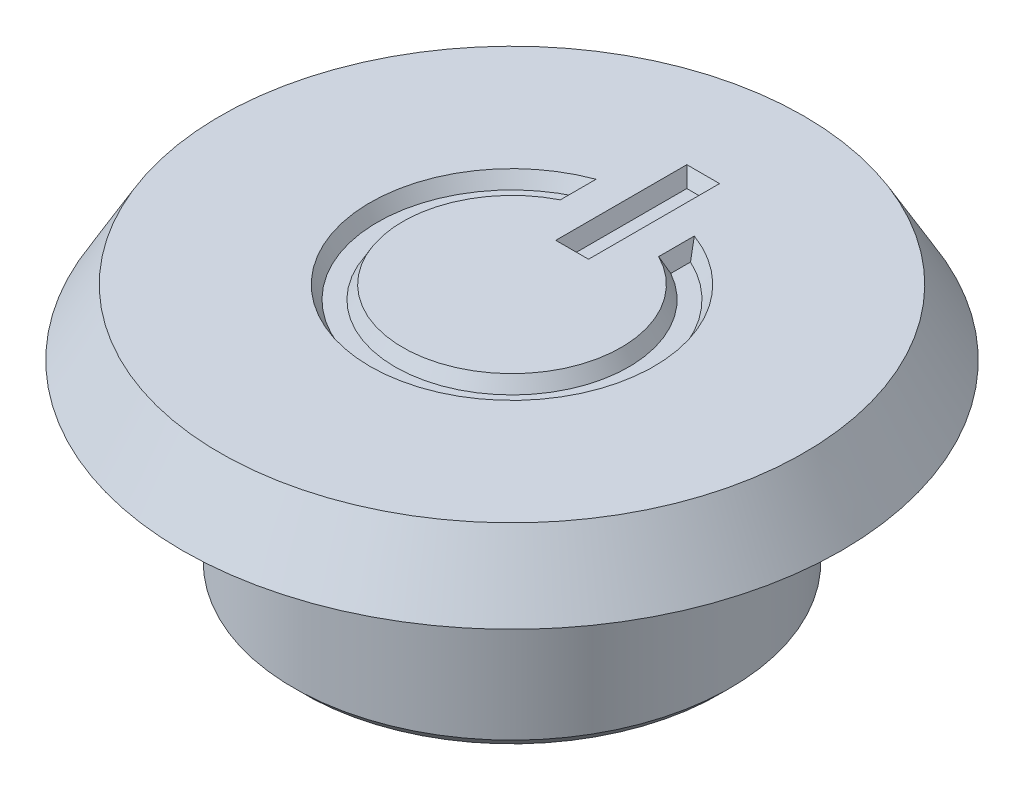
ISO-10303-21;
HEADER;
FILE_DESCRIPTION(('STEP AP214'),'2;1');
FILE_NAME('part.step','',(''),(''),'','','');
FILE_SCHEMA(('AUTOMOTIVE_DESIGN { 1 0 10303 214 1 1 1 1 }'));
ENDSEC;
DATA;
#1=APPLICATION_CONTEXT('core data for automotive mechanical design processes');
#2=APPLICATION_PROTOCOL_DEFINITION('international standard','automotive_design',2000,#1);
#3=PRODUCT_CONTEXT('',#1,'mechanical');
#4=PRODUCT('Part','Part','',(#3));
#5=PRODUCT_RELATED_PRODUCT_CATEGORY('part','',(#4));
#6=PRODUCT_DEFINITION_FORMATION('','',#4);
#7=PRODUCT_DEFINITION_CONTEXT('part definition',#1,'design');
#8=PRODUCT_DEFINITION('design','',#6,#7);
#9=PRODUCT_DEFINITION_SHAPE('','',#8);
#10=(LENGTH_UNIT() NAMED_UNIT(*) SI_UNIT(.MILLI.,.METRE.));
#11=(NAMED_UNIT(*) PLANE_ANGLE_UNIT() SI_UNIT($,.RADIAN.));
#12=(NAMED_UNIT(*) SI_UNIT($,.STERADIAN.) SOLID_ANGLE_UNIT());
#13=UNCERTAINTY_MEASURE_WITH_UNIT(LENGTH_MEASURE(1.E-05),#10,'distance_accuracy_value','');
#14=(GEOMETRIC_REPRESENTATION_CONTEXT(3) GLOBAL_UNCERTAINTY_ASSIGNED_CONTEXT((#13)) GLOBAL_UNIT_ASSIGNED_CONTEXT((#10,
#11,#12)) REPRESENTATION_CONTEXT('',''));
#15=CARTESIAN_POINT('',(0.,0.,0.));
#16=DIRECTION('',(0.,0.,1.));
#17=DIRECTION('',(1.,0.,0.));
#18=AXIS2_PLACEMENT_3D('',#15,#16,#17);
#19=CARTESIAN_POINT('',(-15.,61.1009950989381,0.));
#20=DIRECTION('',(0.,1.,0.));
#21=DIRECTION('',(0.,0.,1.));
#22=AXIS2_PLACEMENT_3D('',#19,#20,#21);
#23=PLANE('',#22);
#24=CARTESIAN_POINT('',(0.,61.1009950989381,0.));
#25=DIRECTION('',(0.,-1.,0.));
#26=DIRECTION('',(0.,0.,-1.));
#27=AXIS2_PLACEMENT_3D('',#24,#25,#26);
#28=CIRCLE('',#27,15.);
#29=CARTESIAN_POINT('',(0.,61.1009950989381,-15.));
#30=VERTEX_POINT('',#29);
#31=EDGE_CURVE('E11',#30,#30,#28,.T.);
#32=ORIENTED_EDGE('',*,*,#31,.T.);
#33=EDGE_LOOP('',(#32));
#34=FACE_BOUND('',#33,.T.);
#35=ADVANCED_FACE('F35',(#34),#23,.F.);
#36=CARTESIAN_POINT('',(0.,58.1009950989381,0.));
#37=DIRECTION('',(0.,-1.,0.));
#38=DIRECTION('',(0.,0.,-1.));
#39=AXIS2_PLACEMENT_3D('',#36,#37,#38);
#40=TOROIDAL_SURFACE('',#39,15.,3.);
#41=ORIENTED_EDGE('',*,*,#31,.F.);
#42=EDGE_LOOP('',(#41));
#43=FACE_BOUND('',#42,.T.);
#44=CARTESIAN_POINT('',(0.,58.100995098938,0.));
#45=DIRECTION('',(0.,-1.,0.));
#46=DIRECTION('',(0.,0.,-1.));
#47=AXIS2_PLACEMENT_3D('',#44,#45,#46);
#48=CIRCLE('',#47,18.);
#49=CARTESIAN_POINT('',(0.,58.100995098938,-18.));
#50=VERTEX_POINT('',#49);
#51=EDGE_CURVE('E42',#50,#50,#48,.T.);
#52=ORIENTED_EDGE('',*,*,#51,.T.);
#53=EDGE_LOOP('',(#52));
#54=FACE_BOUND('',#53,.T.);
#55=ADVANCED_FACE('F231',(#43,#54),#40,.F.);
#56=CARTESIAN_POINT('',(0.,61.1009950989381,0.));
#57=DIRECTION('',(0.,-1.,0.));
#58=DIRECTION('',(0.,0.,-1.));
#59=AXIS2_PLACEMENT_3D('',#56,#57,#58);
#60=CYLINDRICAL_SURFACE('',#59,18.);
#61=ORIENTED_EDGE('',*,*,#51,.F.);
#62=EDGE_LOOP('',(#61));
#63=FACE_BOUND('',#62,.T.);
#64=CARTESIAN_POINT('',(0.,41.1009950989381,0.));
#65=DIRECTION('',(0.,-1.,0.));
#66=DIRECTION('',(0.,0.,-1.));
#67=AXIS2_PLACEMENT_3D('',#64,#65,#66);
#68=CIRCLE('',#67,18.);
#69=CARTESIAN_POINT('',(0.,41.1009950989381,-18.));
#70=VERTEX_POINT('',#69);
#71=EDGE_CURVE('E226',#70,#70,#68,.T.);
#72=ORIENTED_EDGE('',*,*,#71,.T.);
#73=EDGE_LOOP('',(#72));
#74=FACE_BOUND('',#73,.T.);
#75=ADVANCED_FACE('F233',(#63,#74),#60,.F.);
#76=CARTESIAN_POINT('',(-19.,41.1009950989381,0.));
#77=DIRECTION('',(0.,1.,0.));
#78=DIRECTION('',(0.,0.,1.));
#79=AXIS2_PLACEMENT_3D('',#76,#77,#78);
#80=PLANE('',#79);
#81=ORIENTED_EDGE('',*,*,#71,.F.);
#82=EDGE_LOOP('',(#81));
#83=FACE_BOUND('',#82,.T.);
#84=CARTESIAN_POINT('',(0.,41.1009950989381,0.));
#85=DIRECTION('',(0.,-1.,0.));
#86=DIRECTION('',(0.,0.,-1.));
#87=AXIS2_PLACEMENT_3D('',#84,#85,#86);
#88=CIRCLE('',#87,19.);
#89=CARTESIAN_POINT('',(0.,41.1009950989381,-19.));
#90=VERTEX_POINT('',#89);
#91=EDGE_CURVE('E223',#90,#90,#88,.T.);
#92=ORIENTED_EDGE('',*,*,#91,.T.);
#93=EDGE_LOOP('',(#92));
#94=FACE_BOUND('',#93,.T.);
#95=ADVANCED_FACE('F236',(#83,#94),#80,.F.);
#96=CARTESIAN_POINT('',(0.,42.1009950989381,0.));
#97=DIRECTION('',(0.,1.,0.));
#98=DIRECTION('',(0.,0.,1.));
#99=AXIS2_PLACEMENT_3D('',#96,#97,#98);
#100=CONICAL_SURFACE('',#99,20.,0.785398163397448);
#101=ORIENTED_EDGE('',*,*,#91,.F.);
#102=EDGE_LOOP('',(#101));
#103=FACE_BOUND('',#102,.T.);
#104=CARTESIAN_POINT('',(0.,42.1009950989381,0.));
#105=DIRECTION('',(0.,-1.,0.));
#106=DIRECTION('',(0.,0.,-1.));
#107=AXIS2_PLACEMENT_3D('',#104,#105,#106);
#108=CIRCLE('',#107,20.);
#109=CARTESIAN_POINT('',(0.,42.1009950989381,-20.));
#110=VERTEX_POINT('',#109);
#111=EDGE_CURVE('E220',#110,#110,#108,.T.);
#112=ORIENTED_EDGE('',*,*,#111,.T.);
#113=EDGE_LOOP('',(#112));
#114=FACE_BOUND('',#113,.T.);
#115=ADVANCED_FACE('F242',(#103,#114),#100,.T.);
#116=CARTESIAN_POINT('',(0.,61.1009950989381,0.));
#117=DIRECTION('',(0.,-1.,0.));
#118=DIRECTION('',(0.,0.,-1.));
#119=AXIS2_PLACEMENT_3D('',#116,#117,#118);
#120=CYLINDRICAL_SURFACE('',#119,20.);
#121=ORIENTED_EDGE('',*,*,#111,.F.);
#122=EDGE_LOOP('',(#121));
#123=FACE_BOUND('',#122,.T.);
#124=CARTESIAN_POINT('',(0.,61.1009950989381,0.));
#125=DIRECTION('',(0.,-1.,0.));
#126=DIRECTION('',(0.,0.,-1.));
#127=AXIS2_PLACEMENT_3D('',#124,#125,#126);
#128=CIRCLE('',#127,20.);
#129=CARTESIAN_POINT('',(0.,61.1009950989381,-20.));
#130=VERTEX_POINT('',#129);
#131=EDGE_CURVE('E217',#130,#130,#128,.T.);
#132=ORIENTED_EDGE('',*,*,#131,.T.);
#133=EDGE_LOOP('',(#132));
#134=FACE_BOUND('',#133,.T.);
#135=ADVANCED_FACE('F248',(#123,#134),#120,.T.);
#136=CARTESIAN_POINT('',(-25.,61.1009950989381,0.));
#137=DIRECTION('',(0.,1.,0.));
#138=DIRECTION('',(0.,0.,1.));
#139=AXIS2_PLACEMENT_3D('',#136,#137,#138);
#140=PLANE('',#139);
#141=ORIENTED_EDGE('',*,*,#131,.F.);
#142=EDGE_LOOP('',(#141));
#143=FACE_BOUND('',#142,.T.);
#144=CARTESIAN_POINT('',(0.,61.1009950989381,0.));
#145=DIRECTION('',(0.,-1.,0.));
#146=DIRECTION('',(0.,0.,-1.));
#147=AXIS2_PLACEMENT_3D('',#144,#145,#146);
#148=CIRCLE('',#147,25.);
#149=CARTESIAN_POINT('',(0.,61.1009950989381,-25.));
#150=VERTEX_POINT('',#149);
#151=EDGE_CURVE('E214',#150,#150,#148,.T.);
#152=ORIENTED_EDGE('',*,*,#151,.T.);
#153=EDGE_LOOP('',(#152));
#154=FACE_BOUND('',#153,.T.);
#155=ADVANCED_FACE('F254',(#143,#154),#140,.F.);
#156=CARTESIAN_POINT('',(0.,58.1009950989381,0.));
#157=DIRECTION('',(0.,-1.,0.));
#158=DIRECTION('',(0.,0.,-1.));
#159=AXIS2_PLACEMENT_3D('',#156,#157,#158);
#160=CONICAL_SURFACE('',#159,26.7320508075689,0.523598775598294);
#161=ORIENTED_EDGE('',*,*,#151,.F.);
#162=EDGE_LOOP('',(#161));
#163=FACE_BOUND('',#162,.T.);
#164=CARTESIAN_POINT('',(0.,58.1009950989381,0.));
#165=DIRECTION('',(0.,-1.,0.));
#166=DIRECTION('',(0.,0.,-1.));
#167=AXIS2_PLACEMENT_3D('',#164,#165,#166);
#168=CIRCLE('',#167,26.7320508075689);
#169=CARTESIAN_POINT('',(0.,58.1009950989381,-26.7320508075689));
#170=VERTEX_POINT('',#169);
#171=EDGE_CURVE('E211',#170,#170,#168,.T.);
#172=ORIENTED_EDGE('',*,*,#171,.T.);
#173=EDGE_LOOP('',(#172));
#174=FACE_BOUND('',#173,.T.);
#175=ADVANCED_FACE('F260',(#163,#174),#160,.F.);
#176=CARTESIAN_POINT('',(-30.1961524227066,58.1009950989381,0.));
#177=DIRECTION('',(0.,1.,0.));
#178=DIRECTION('',(0.,0.,1.));
#179=AXIS2_PLACEMENT_3D('',#176,#177,#178);
#180=PLANE('',#179);
#181=ORIENTED_EDGE('',*,*,#171,.F.);
#182=EDGE_LOOP('',(#181));
#183=FACE_BOUND('',#182,.T.);
#184=CARTESIAN_POINT('',(0.,58.1009950989381,0.));
#185=DIRECTION('',(0.,-1.,0.));
#186=DIRECTION('',(0.,0.,-1.));
#187=AXIS2_PLACEMENT_3D('',#184,#185,#186);
#188=CIRCLE('',#187,30.1961524227066);
#189=CARTESIAN_POINT('',(0.,58.1009950989381,-30.1961524227066));
#190=VERTEX_POINT('',#189);
#191=EDGE_CURVE('E208',#190,#190,#188,.T.);
#192=ORIENTED_EDGE('',*,*,#191,.T.);
#193=EDGE_LOOP('',(#192));
#194=FACE_BOUND('',#193,.T.);
#195=ADVANCED_FACE('F266',(#183,#194),#180,.F.);
#196=CARTESIAN_POINT('',(0.,64.1009950989381,0.));
#197=DIRECTION('',(0.,-1.,0.));
#198=DIRECTION('',(0.,0.,-1.));
#199=AXIS2_PLACEMENT_3D('',#196,#197,#198);
#200=CONICAL_SURFACE('',#199,26.7320508075689,0.523598775598294);
#201=ORIENTED_EDGE('',*,*,#191,.F.);
#202=EDGE_LOOP('',(#201));
#203=FACE_BOUND('',#202,.T.);
#204=CARTESIAN_POINT('',(0.,64.1009950989381,0.));
#205=DIRECTION('',(0.,-1.,0.));
#206=DIRECTION('',(0.,0.,-1.));
#207=AXIS2_PLACEMENT_3D('',#204,#205,#206);
#208=CIRCLE('',#207,26.7320508075689);
#209=CARTESIAN_POINT('',(0.,64.1009950989381,-26.7320508075689));
#210=VERTEX_POINT('',#209);
#211=EDGE_CURVE('E158',#210,#210,#208,.T.);
#212=ORIENTED_EDGE('',*,*,#211,.T.);
#213=EDGE_LOOP('',(#212));
#214=FACE_BOUND('',#213,.T.);
#215=ADVANCED_FACE('F272',(#203,#214),#200,.T.);
#216=CARTESIAN_POINT('',(0.,64.1009950989381,0.));
#217=DIRECTION('',(0.,-1.,0.));
#218=DIRECTION('',(0.,0.,-1.));
#219=AXIS2_PLACEMENT_3D('',#216,#217,#218);
#220=PLANE('',#219);
#221=DIRECTION('',(-1.,0.,0.));
#222=VECTOR('',#221,1.);
#223=CARTESIAN_POINT('',(-1.5,64.1009950989381,-17.5096308794023));
#224=LINE('',#223,#222);
#225=CARTESIAN_POINT('',(1.5,64.1009950989381,-17.5096308794023));
#226=VERTEX_POINT('',#225);
#227=CARTESIAN_POINT('',(-1.5,64.1009950989381,-17.5096308794023));
#228=VERTEX_POINT('',#227);
#229=EDGE_CURVE('E114',#226,#228,#224,.T.);
#230=ORIENTED_EDGE('',*,*,#229,.F.);
#231=DIRECTION('',(0.,0.,-1.));
#232=VECTOR('',#231,1.);
#233=CARTESIAN_POINT('',(1.5,64.1009950989381,-17.5096308794023));
#234=LINE('',#233,#232);
#235=CARTESIAN_POINT('',(1.5,64.1009950989381,-5.50963087940227));
#236=VERTEX_POINT('',#235);
#237=EDGE_CURVE('E49',#236,#226,#234,.T.);
#238=ORIENTED_EDGE('',*,*,#237,.F.);
#239=DIRECTION('',(1.,0.,0.));
#240=VECTOR('',#239,1.);
#241=CARTESIAN_POINT('',(-1.5,64.1009950989381,-5.50963087940227));
#242=LINE('',#241,#240);
#243=CARTESIAN_POINT('',(-1.5,64.1009950989381,-5.50963087940227));
#244=VERTEX_POINT('',#243);
#245=EDGE_CURVE('E121',#244,#236,#242,.T.);
#246=ORIENTED_EDGE('',*,*,#245,.F.);
#247=DIRECTION('',(0.,0.,1.));
#248=VECTOR('',#247,1.);
#249=CARTESIAN_POINT('',(-1.5,64.1009950989381,-17.5096308794023));
#250=LINE('',#249,#248);
#251=EDGE_CURVE('E103',#228,#244,#250,.T.);
#252=ORIENTED_EDGE('',*,*,#251,.F.);
#253=EDGE_LOOP('',(#230,#238,#246,#252));
#254=FACE_BOUND('',#253,.T.);
#255=DIRECTION('',(0.,0.,-1.));
#256=VECTOR('',#255,1.);
#257=CARTESIAN_POINT('',(-4.5,64.1009950989381,-12.1963109176505));
#258=LINE('',#257,#256);
#259=CARTESIAN_POINT('',(-4.5,64.1009950989381,-8.93028554974587));
#260=VERTEX_POINT('',#259);
#261=CARTESIAN_POINT('',(-4.5,64.1009950989381,-12.1963109176505));
#262=VERTEX_POINT('',#261);
#263=EDGE_CURVE('E140',#260,#262,#258,.T.);
#264=ORIENTED_EDGE('',*,*,#263,.F.);
#265=CARTESIAN_POINT('',(0.,64.1009950989381,0.));
#266=DIRECTION('',(0.,-1.,0.));
#267=DIRECTION('',(0.,0.,1.));
#268=AXIS2_PLACEMENT_3D('',#265,#266,#267);
#269=CIRCLE('',#268,10.);
#270=CARTESIAN_POINT('',(4.5,64.1009950989381,-8.93028554974588));
#271=VERTEX_POINT('',#270);
#272=EDGE_CURVE('E57',#271,#260,#269,.T.);
#273=ORIENTED_EDGE('',*,*,#272,.F.);
#274=DIRECTION('',(0.,0.,1.));
#275=VECTOR('',#274,1.);
#276=CARTESIAN_POINT('',(4.5,64.1009950989381,-12.1963109176505));
#277=LINE('',#276,#275);
#278=CARTESIAN_POINT('',(4.5,64.1009950989381,-12.1963109176505));
#279=VERTEX_POINT('',#278);
#280=EDGE_CURVE('E146',#279,#271,#277,.T.);
#281=ORIENTED_EDGE('',*,*,#280,.F.);
#282=CARTESIAN_POINT('',(0.,64.1009950989381,0.));
#283=DIRECTION('',(0.,1.,0.));
#284=DIRECTION('',(0.,0.,1.));
#285=AXIS2_PLACEMENT_3D('',#282,#283,#284);
#286=CIRCLE('',#285,13.);
#287=EDGE_CURVE('E143',#262,#279,#286,.T.);
#288=ORIENTED_EDGE('',*,*,#287,.F.);
#289=EDGE_LOOP('',(#264,#273,#281,#288));
#290=FACE_BOUND('',#289,.T.);
#291=ORIENTED_EDGE('',*,*,#211,.F.);
#292=EDGE_LOOP('',(#291));
#293=FACE_BOUND('',#292,.T.);
#294=ADVANCED_FACE('F118',(#254,#290,#293),#220,.F.);
#295=CARTESIAN_POINT('',(0.,64.1009950989381,0.));
#296=DIRECTION('',(0.,-1.,0.));
#297=DIRECTION('',(0.,0.,1.));
#298=AXIS2_PLACEMENT_3D('',#295,#296,#297);
#299=CONICAL_SURFACE('',#298,10.,0.5235987755983);
#300=ORIENTED_EDGE('',*,*,#272,.T.);
#301=CARTESIAN_POINT('',(-5.19282032302756,62.9009950989381,-9.34724684349906));
#302=CARTESIAN_POINT('',(-5.07713160968526,63.1013738283092,-9.27920686529294));
#303=CARTESIAN_POINT('',(-4.96155224520797,63.3015631598904,-9.21044011347603));
#304=CARTESIAN_POINT('',(-4.73061213738704,63.7015631601417,-9.07145301652251));
#305=CARTESIAN_POINT('',(-4.61525139418848,63.9013738285605,-9.00123267042171));
#306=CARTESIAN_POINT('',(-4.5,64.1009950989381,-8.9302855497459));
#307=B_SPLINE_CURVE_WITH_KNOTS('',3,(#301,#302,#303,#304,#305,#306),.UNSPECIFIED.,.F.,.F.,(4,2,
4),(0.,0.723511587430468,1.44702365479791),.UNSPECIFIED.);
#308=CARTESIAN_POINT('',(-5.19282032302756,62.9009950989381,-9.34724684349906));
#309=VERTEX_POINT('',#308);
#310=EDGE_CURVE('E160',#309,#260,#307,.T.);
#311=ORIENTED_EDGE('',*,*,#310,.F.);
#312=CARTESIAN_POINT('',(0.,62.9009950989381,0.));
#313=DIRECTION('',(0.,1.,0.));
#314=DIRECTION('',(0.,0.,1.));
#315=AXIS2_PLACEMENT_3D('',#312,#313,#314);
#316=CIRCLE('',#315,10.6928203230276);
#317=CARTESIAN_POINT('',(5.19282032302755,62.9009950989381,-9.34724684349906));
#318=VERTEX_POINT('',#317);
#319=EDGE_CURVE('E149',#318,#309,#316,.F.);
#320=ORIENTED_EDGE('',*,*,#319,.F.);
#321=CARTESIAN_POINT('',(5.19282032302755,62.9009950989381,-9.34724684349906));
#322=CARTESIAN_POINT('',(5.07713160968526,63.1013738283092,-9.27920686529295));
#323=CARTESIAN_POINT('',(4.96155224520796,63.3015631598904,-9.21044011347603));
#324=CARTESIAN_POINT('',(4.73061213738704,63.7015631601417,-9.07145301652252));
#325=CARTESIAN_POINT('',(4.61525139418848,63.9013738285605,-9.00123267042171));
#326=CARTESIAN_POINT('',(4.49999999999999,64.1009950989381,-8.93028554974591));
#327=B_SPLINE_CURVE_WITH_KNOTS('',3,(#321,#322,#323,#324,#325,#326),.UNSPECIFIED.,.F.,.F.,(4,2,
4),(0.,0.723511587430467,1.44702365479791),.UNSPECIFIED.);
#328=EDGE_CURVE('E150',#318,#271,#327,.T.);
#329=ORIENTED_EDGE('',*,*,#328,.T.);
#330=EDGE_LOOP('',(#300,#311,#320,#329));
#331=FACE_BOUND('',#330,.T.);
#332=ADVANCED_FACE('F170',(#331),#299,.T.);
#333=CARTESIAN_POINT('',(4.5,64.1009950989381,-12.1963109176505));
#334=DIRECTION('',(-0.866025403784438,-0.500000000000001,0.));
#335=DIRECTION('',(0.500000000000001,-0.866025403784438,0.));
#336=AXIS2_PLACEMENT_3D('',#333,#334,#335);
#337=PLANE('',#336);
#338=ORIENTED_EDGE('',*,*,#280,.T.);
#339=ORIENTED_EDGE('',*,*,#328,.F.);
#340=DIRECTION('',(0.,0.,1.));
#341=VECTOR('',#340,1.);
#342=CARTESIAN_POINT('',(5.19282032302755,62.9009950989381,0.));
#343=LINE('',#342,#341);
#344=CARTESIAN_POINT('',(5.19282032302755,62.9009950989381,-11.1580145498218));
#345=VERTEX_POINT('',#344);
#346=EDGE_CURVE('E198',#345,#318,#343,.T.);
#347=ORIENTED_EDGE('',*,*,#346,.F.);
#348=CARTESIAN_POINT('',(5.19282032302755,62.9009950989381,-11.1580145498218));
#349=CARTESIAN_POINT('',(5.13604080804529,62.9993401037165,-11.2470654450488));
#350=CARTESIAN_POINT('',(5.07900323717961,63.0981320743961,-11.3354568617994));
#351=CARTESIAN_POINT('',(4.96444630248966,63.2965505056385,-11.5109549401037));
#352=CARTESIAN_POINT('',(4.90692699421274,63.3961768699903,-11.5980617466685));
#353=CARTESIAN_POINT('',(4.7914284723562,63.596226178045,-11.7710442982828));
#354=CARTESIAN_POINT('',(4.73344926276343,63.6966491148423,-11.8569200539861));
#355=CARTESIAN_POINT('',(4.61704856868722,63.8982610310186,-12.0274922644601));
#356=CARTESIAN_POINT('',(4.55862703463764,63.9994500962486,-12.112188583953));
#357=CARTESIAN_POINT('',(4.5,64.1009950989381,-12.1963109176505));
#358=B_SPLINE_CURVE_WITH_KNOTS('',3,(#348,#349,#350,#351,#352,#353,#354,#355,#356,#357),
.UNSPECIFIED.,.F.,.F.,(4,2,2,2,4),(0.,0.432929917183962,0.865810583868889,1.29868750202182,
1.73161366756528),.UNSPECIFIED.);
#359=EDGE_CURVE('E159',#345,#279,#358,.T.);
#360=ORIENTED_EDGE('',*,*,#359,.T.);
#361=EDGE_LOOP('',(#338,#339,#347,#360));
#362=FACE_BOUND('',#361,.T.);
#363=ADVANCED_FACE('F167',(#362),#337,.F.);
#364=CARTESIAN_POINT('',(0.,64.1009950989381,0.));
#365=DIRECTION('',(0.,1.,0.));
#366=DIRECTION('',(0.,0.,1.));
#367=AXIS2_PLACEMENT_3D('',#364,#365,#366);
#368=CONICAL_SURFACE('',#367,13.,0.5235987755983);
#369=ORIENTED_EDGE('',*,*,#287,.T.);
#370=ORIENTED_EDGE('',*,*,#359,.F.);
#371=CARTESIAN_POINT('',(0.,62.9009950989381,0.));
#372=DIRECTION('',(0.,1.,0.));
#373=DIRECTION('',(0.,0.,1.));
#374=AXIS2_PLACEMENT_3D('',#371,#372,#373);
#375=CIRCLE('',#374,12.3071796769724);
#376=CARTESIAN_POINT('',(-5.19282032302756,62.9009950989381,-11.1580145498218));
#377=VERTEX_POINT('',#376);
#378=EDGE_CURVE('E201',#377,#345,#375,.T.);
#379=ORIENTED_EDGE('',*,*,#378,.F.);
#380=CARTESIAN_POINT('',(-5.19282032302756,62.9009950989381,-11.1580145498218));
#381=CARTESIAN_POINT('',(-5.13604080804529,62.9993401037165,-11.2470654450488));
#382=CARTESIAN_POINT('',(-5.07900323717961,63.0981320743961,-11.3354568617994));
#383=CARTESIAN_POINT('',(-4.96444630248966,63.2965505056385,-11.5109549401037));
#384=CARTESIAN_POINT('',(-4.90692699421275,63.3961768699903,-11.5980617466685));
#385=CARTESIAN_POINT('',(-4.7914284723562,63.596226178045,-11.7710442982828));
#386=CARTESIAN_POINT('',(-4.73344926276342,63.6966491148423,-11.8569200539861));
#387=CARTESIAN_POINT('',(-4.61704856868722,63.8982610310186,-12.0274922644601));
#388=CARTESIAN_POINT('',(-4.55862703463764,63.9994500962486,-12.112188583953));
#389=CARTESIAN_POINT('',(-4.5,64.1009950989381,-12.1963109176505));
#390=B_SPLINE_CURVE_WITH_KNOTS('',3,(#380,#381,#382,#383,#384,#385,#386,#387,#388,#389),
.UNSPECIFIED.,.F.,.F.,(4,2,2,2,4),(0.,0.43292991718396,0.865810583868887,1.29868750202184,
1.73161366756528),.UNSPECIFIED.);
#391=EDGE_CURVE('E184',#377,#262,#390,.T.);
#392=ORIENTED_EDGE('',*,*,#391,.T.);
#393=EDGE_LOOP('',(#369,#370,#379,#392));
#394=FACE_BOUND('',#393,.T.);
#395=ADVANCED_FACE('F179',(#394),#368,.F.);
#396=CARTESIAN_POINT('',(-4.5,64.1009950989381,-12.1963109176505));
#397=DIRECTION('',(0.866025403784438,-0.500000000000001,0.));
#398=DIRECTION('',(0.500000000000001,0.866025403784438,0.));
#399=AXIS2_PLACEMENT_3D('',#396,#397,#398);
#400=PLANE('',#399);
#401=ORIENTED_EDGE('',*,*,#263,.T.);
#402=ORIENTED_EDGE('',*,*,#391,.F.);
#403=DIRECTION('',(0.,0.,-1.));
#404=VECTOR('',#403,1.);
#405=CARTESIAN_POINT('',(-5.19282032302755,62.9009950989381,0.));
#406=LINE('',#405,#404);
#407=EDGE_CURVE('E197',#309,#377,#406,.T.);
#408=ORIENTED_EDGE('',*,*,#407,.F.);
#409=ORIENTED_EDGE('',*,*,#310,.T.);
#410=EDGE_LOOP('',(#401,#402,#408,#409));
#411=FACE_BOUND('',#410,.T.);
#412=ADVANCED_FACE('F173',(#411),#400,.F.);
#413=CARTESIAN_POINT('',(0.,62.9009950989381,0.));
#414=DIRECTION('',(0.,1.,0.));
#415=DIRECTION('',(0.,0.,1.));
#416=AXIS2_PLACEMENT_3D('',#413,#414,#415);
#417=PLANE('',#416);
#418=ORIENTED_EDGE('',*,*,#319,.T.);
#419=ORIENTED_EDGE('',*,*,#407,.T.);
#420=ORIENTED_EDGE('',*,*,#378,.T.);
#421=ORIENTED_EDGE('',*,*,#346,.T.);
#422=EDGE_LOOP('',(#418,#419,#420,#421));
#423=FACE_BOUND('',#422,.T.);
#424=ADVANCED_FACE('F178',(#423),#417,.T.);
#425=CARTESIAN_POINT('',(1.5,64.1009950989381,-17.5096308794023));
#426=DIRECTION('',(0.866025403784438,-0.500000000000001,0.));
#427=DIRECTION('',(0.500000000000001,0.866025403784438,0.));
#428=AXIS2_PLACEMENT_3D('',#425,#426,#427);
#429=PLANE('',#428);
#430=ORIENTED_EDGE('',*,*,#237,.T.);
#431=DIRECTION('',(0.447213595499959,0.774596669241483,-0.447213595499959));
#432=VECTOR('',#431,1.);
#433=CARTESIAN_POINT('',(1.5,64.1009950989381,-17.5096308794023));
#434=LINE('',#433,#432);
#435=CARTESIAN_POINT('',(0.80717967697244,62.9009950989381,-16.8168105563747));
#436=VERTEX_POINT('',#435);
#437=EDGE_CURVE('E111',#436,#226,#434,.T.);
#438=ORIENTED_EDGE('',*,*,#437,.F.);
#439=DIRECTION('',(0.,0.,-1.));
#440=VECTOR('',#439,1.);
#441=CARTESIAN_POINT('',(0.807179676972445,62.9009950989381,0.));
#442=LINE('',#441,#440);
#443=CARTESIAN_POINT('',(0.807179676972443,62.9009950989381,-6.20245120242982));
#444=VERTEX_POINT('',#443);
#445=EDGE_CURVE('E123',#444,#436,#442,.T.);
#446=ORIENTED_EDGE('',*,*,#445,.F.);
#447=DIRECTION('',(0.447213595499959,0.774596669241483,0.447213595499959));
#448=VECTOR('',#447,1.);
#449=CARTESIAN_POINT('',(0.899999999999998,63.0617646143968,-6.10963087940227));
#450=LINE('',#449,#448);
#451=EDGE_CURVE('E127',#444,#236,#450,.T.);
#452=ORIENTED_EDGE('',*,*,#451,.T.);
#453=EDGE_LOOP('',(#430,#438,#446,#452));
#454=FACE_BOUND('',#453,.T.);
#455=ADVANCED_FACE('F366',(#454),#429,.F.);
#456=CARTESIAN_POINT('',(-1.5,64.1009950989381,-5.50963087940227));
#457=DIRECTION('',(0.,-0.500000000000001,0.866025403784438));
#458=DIRECTION('',(0.,-0.866025403784438,-0.500000000000001));
#459=AXIS2_PLACEMENT_3D('',#456,#457,#458);
#460=PLANE('',#459);
#461=ORIENTED_EDGE('',*,*,#245,.T.);
#462=ORIENTED_EDGE('',*,*,#451,.F.);
#463=DIRECTION('',(1.,0.,0.));
#464=VECTOR('',#463,1.);
#465=CARTESIAN_POINT('',(0.,62.9009950989381,-6.20245120242982));
#466=LINE('',#465,#464);
#467=CARTESIAN_POINT('',(-0.807179676972444,62.9009950989381,-6.20245120242982));
#468=VERTEX_POINT('',#467);
#469=EDGE_CURVE('E129',#468,#444,#466,.T.);
#470=ORIENTED_EDGE('',*,*,#469,.F.);
#471=DIRECTION('',(-0.447213595499958,0.774596669241483,0.447213595499959));
#472=VECTOR('',#471,1.);
#473=CARTESIAN_POINT('',(0.900000000000006,59.9440731607728,-7.90963087940228));
#474=LINE('',#473,#472);
#475=EDGE_CURVE('E110',#468,#244,#474,.T.);
#476=ORIENTED_EDGE('',*,*,#475,.T.);
#477=EDGE_LOOP('',(#461,#462,#470,#476));
#478=FACE_BOUND('',#477,.T.);
#479=ADVANCED_FACE('F375',(#478),#460,.F.);
#480=CARTESIAN_POINT('',(-1.5,64.1009950989381,-17.5096308794023));
#481=DIRECTION('',(-0.866025403784438,-0.500000000000001,0.));
#482=DIRECTION('',(0.500000000000001,-0.866025403784438,0.));
#483=AXIS2_PLACEMENT_3D('',#480,#481,#482);
#484=PLANE('',#483);
#485=ORIENTED_EDGE('',*,*,#251,.T.);
#486=ORIENTED_EDGE('',*,*,#475,.F.);
#487=DIRECTION('',(0.,0.,1.));
#488=VECTOR('',#487,1.);
#489=CARTESIAN_POINT('',(-0.807179676972443,62.9009950989381,0.));
#490=LINE('',#489,#488);
#491=CARTESIAN_POINT('',(-0.807179676972447,62.9009950989381,-16.8168105563747));
#492=VERTEX_POINT('',#491);
#493=EDGE_CURVE('E106',#492,#468,#490,.T.);
#494=ORIENTED_EDGE('',*,*,#493,.F.);
#495=DIRECTION('',(-0.447213595499959,0.774596669241482,-0.447213595499959));
#496=VECTOR('',#495,1.);
#497=CARTESIAN_POINT('',(-1.5,64.1009950989381,-17.5096308794023));
#498=LINE('',#497,#496);
#499=EDGE_CURVE('E99',#492,#228,#498,.T.);
#500=ORIENTED_EDGE('',*,*,#499,.T.);
#501=EDGE_LOOP('',(#485,#486,#494,#500));
#502=FACE_BOUND('',#501,.T.);
#503=ADVANCED_FACE('F101',(#502),#484,.F.);
#504=CARTESIAN_POINT('',(-1.5,64.1009950989381,-17.5096308794023));
#505=DIRECTION('',(0.,-0.500000000000001,-0.866025403784438));
#506=DIRECTION('',(0.,0.866025403784438,-0.500000000000001));
#507=AXIS2_PLACEMENT_3D('',#504,#505,#506);
#508=PLANE('',#507);
#509=ORIENTED_EDGE('',*,*,#229,.T.);
#510=ORIENTED_EDGE('',*,*,#499,.F.);
#511=DIRECTION('',(-1.,0.,0.));
#512=VECTOR('',#511,1.);
#513=CARTESIAN_POINT('',(0.,62.9009950989381,-16.8168105563747));
#514=LINE('',#513,#512);
#515=EDGE_CURVE('E134',#436,#492,#514,.T.);
#516=ORIENTED_EDGE('',*,*,#515,.F.);
#517=ORIENTED_EDGE('',*,*,#437,.T.);
#518=EDGE_LOOP('',(#509,#510,#516,#517));
#519=FACE_BOUND('',#518,.T.);
#520=ADVANCED_FACE('F115',(#519),#508,.F.);
#521=CARTESIAN_POINT('',(0.,62.9009950989381,0.));
#522=DIRECTION('',(0.,1.,0.));
#523=DIRECTION('',(0.,0.,1.));
#524=AXIS2_PLACEMENT_3D('',#521,#522,#523);
#525=PLANE('',#524);
#526=ORIENTED_EDGE('',*,*,#445,.T.);
#527=ORIENTED_EDGE('',*,*,#515,.T.);
#528=ORIENTED_EDGE('',*,*,#493,.T.);
#529=ORIENTED_EDGE('',*,*,#469,.T.);
#530=EDGE_LOOP('',(#526,#527,#528,#529));
#531=FACE_BOUND('',#530,.T.);
#532=ADVANCED_FACE('F401',(#531),#525,.T.);
#533=CLOSED_SHELL('',(#35,#55,#75,#95,#115,#135,#155,#175,#195,#215,#294,#332,#363,#395,#412,
#424,#455,#479,#503,#520,#532));
#534=MANIFOLD_SOLID_BREP('B2',#533);
#535=ADVANCED_BREP_SHAPE_REPRESENTATION('',(#18,#534),#14);
#536=SHAPE_DEFINITION_REPRESENTATION(#9,#535);
ENDSEC;
END-ISO-10303-21;
